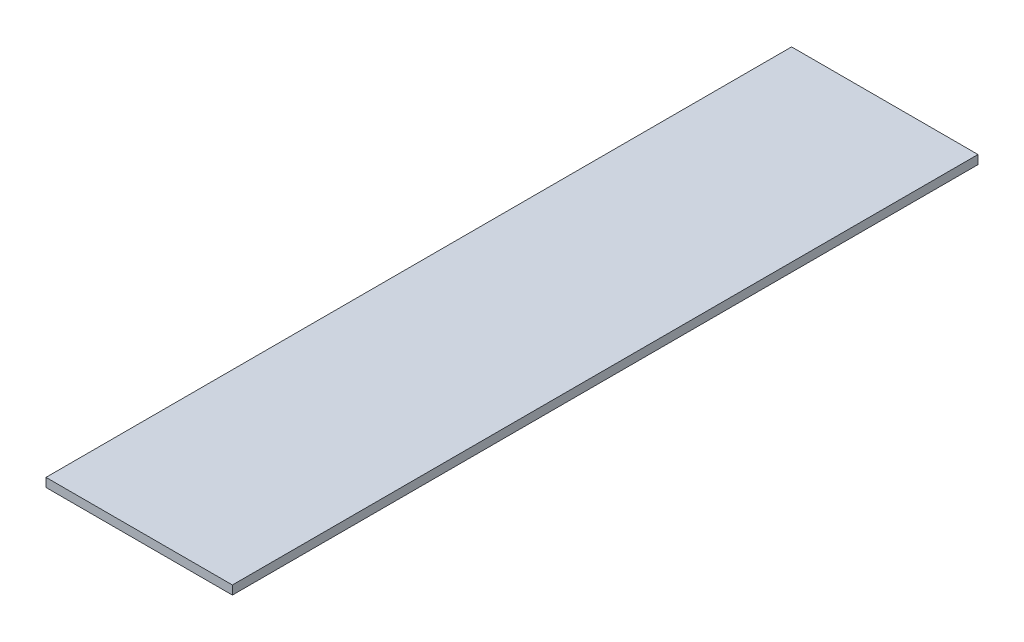
ISO-10303-21;
HEADER;
FILE_DESCRIPTION(('STEP AP214'),'2;1');
FILE_NAME('part.step','',(''),(''),'','','');
FILE_SCHEMA(('AUTOMOTIVE_DESIGN { 1 0 10303 214 1 1 1 1 }'));
ENDSEC;
DATA;
#1=APPLICATION_CONTEXT('core data for automotive mechanical design processes');
#2=APPLICATION_PROTOCOL_DEFINITION('international standard','automotive_design',2000,#1);
#3=PRODUCT_CONTEXT('',#1,'mechanical');
#4=PRODUCT('Part','Part','',(#3));
#5=PRODUCT_RELATED_PRODUCT_CATEGORY('part','',(#4));
#6=PRODUCT_DEFINITION_FORMATION('','',#4);
#7=PRODUCT_DEFINITION_CONTEXT('part definition',#1,'design');
#8=PRODUCT_DEFINITION('design','',#6,#7);
#9=PRODUCT_DEFINITION_SHAPE('','',#8);
#10=(LENGTH_UNIT() NAMED_UNIT(*) SI_UNIT(.MILLI.,.METRE.));
#11=(NAMED_UNIT(*) PLANE_ANGLE_UNIT() SI_UNIT($,.RADIAN.));
#12=(NAMED_UNIT(*) SI_UNIT($,.STERADIAN.) SOLID_ANGLE_UNIT());
#13=UNCERTAINTY_MEASURE_WITH_UNIT(LENGTH_MEASURE(1.E-05),#10,'distance_accuracy_value','');
#14=(GEOMETRIC_REPRESENTATION_CONTEXT(3) GLOBAL_UNCERTAINTY_ASSIGNED_CONTEXT((#13)) GLOBAL_UNIT_ASSIGNED_CONTEXT((#10,
#11,#12)) REPRESENTATION_CONTEXT('',''));
#15=CARTESIAN_POINT('',(0.,0.,0.));
#16=DIRECTION('',(0.,0.,1.));
#17=DIRECTION('',(1.,0.,0.));
#18=AXIS2_PLACEMENT_3D('',#15,#16,#17);
#19=CARTESIAN_POINT('',(12.5,1.18,50.));
#20=DIRECTION('',(-1.,0.,0.));
#21=DIRECTION('',(0.,0.,1.));
#22=AXIS2_PLACEMENT_3D('',#19,#20,#21);
#23=PLANE('',#22);
#24=DIRECTION('',(0.,0.,-1.));
#25=VECTOR('',#24,1.);
#26=CARTESIAN_POINT('',(12.5,0.,50.));
#27=LINE('',#26,#25);
#28=CARTESIAN_POINT('',(12.5,0.,50.));
#29=VERTEX_POINT('',#28);
#30=CARTESIAN_POINT('',(12.5,0.,-50.));
#31=VERTEX_POINT('',#30);
#32=EDGE_CURVE('E107',#29,#31,#27,.T.);
#33=ORIENTED_EDGE('',*,*,#32,.T.);
#34=DIRECTION('',(0.,-1.,0.));
#35=VECTOR('',#34,1.);
#36=CARTESIAN_POINT('',(12.5,1.18,-50.));
#37=LINE('',#36,#35);
#38=CARTESIAN_POINT('',(12.5,1.18,-50.));
#39=VERTEX_POINT('',#38);
#40=EDGE_CURVE('E11',#39,#31,#37,.T.);
#41=ORIENTED_EDGE('',*,*,#40,.F.);
#42=DIRECTION('',(0.,0.,-1.));
#43=VECTOR('',#42,1.);
#44=CARTESIAN_POINT('',(12.5,1.18,50.));
#45=LINE('',#44,#43);
#46=CARTESIAN_POINT('',(12.5,1.18,50.));
#47=VERTEX_POINT('',#46);
#48=EDGE_CURVE('E91',#47,#39,#45,.T.);
#49=ORIENTED_EDGE('',*,*,#48,.F.);
#50=DIRECTION('',(0.,-1.,0.));
#51=VECTOR('',#50,1.);
#52=CARTESIAN_POINT('',(12.5,1.18,50.));
#53=LINE('',#52,#51);
#54=EDGE_CURVE('E103',#47,#29,#53,.T.);
#55=ORIENTED_EDGE('',*,*,#54,.T.);
#56=EDGE_LOOP('',(#33,#41,#49,#55));
#57=FACE_BOUND('',#56,.T.);
#58=ADVANCED_FACE('F39',(#57),#23,.F.);
#59=CARTESIAN_POINT('',(-12.5,1.18,-50.));
#60=DIRECTION('',(0.,0.,1.));
#61=DIRECTION('',(1.,0.,0.));
#62=AXIS2_PLACEMENT_3D('',#59,#60,#61);
#63=PLANE('',#62);
#64=DIRECTION('',(-1.,0.,0.));
#65=VECTOR('',#64,1.);
#66=CARTESIAN_POINT('',(-12.5,0.,-50.));
#67=LINE('',#66,#65);
#68=CARTESIAN_POINT('',(-12.5,0.,-50.));
#69=VERTEX_POINT('',#68);
#70=EDGE_CURVE('E96',#31,#69,#67,.T.);
#71=ORIENTED_EDGE('',*,*,#70,.T.);
#72=DIRECTION('',(0.,-1.,0.));
#73=VECTOR('',#72,1.);
#74=CARTESIAN_POINT('',(-12.5,1.18,-50.));
#75=LINE('',#74,#73);
#76=CARTESIAN_POINT('',(-12.5,1.18,-50.));
#77=VERTEX_POINT('',#76);
#78=EDGE_CURVE('E48',#77,#69,#75,.T.);
#79=ORIENTED_EDGE('',*,*,#78,.F.);
#80=DIRECTION('',(-1.,0.,0.));
#81=VECTOR('',#80,1.);
#82=CARTESIAN_POINT('',(-12.5,1.18,-50.));
#83=LINE('',#82,#81);
#84=EDGE_CURVE('E86',#39,#77,#83,.T.);
#85=ORIENTED_EDGE('',*,*,#84,.F.);
#86=ORIENTED_EDGE('',*,*,#40,.T.);
#87=EDGE_LOOP('',(#71,#79,#85,#86));
#88=FACE_BOUND('',#87,.T.);
#89=ADVANCED_FACE('F95',(#88),#63,.F.);
#90=CARTESIAN_POINT('',(-12.5,1.18,50.));
#91=DIRECTION('',(1.,0.,0.));
#92=DIRECTION('',(0.,0.,-1.));
#93=AXIS2_PLACEMENT_3D('',#90,#91,#92);
#94=PLANE('',#93);
#95=DIRECTION('',(0.,0.,1.));
#96=VECTOR('',#95,1.);
#97=CARTESIAN_POINT('',(-12.5,0.,50.));
#98=LINE('',#97,#96);
#99=CARTESIAN_POINT('',(-12.5,0.,50.));
#100=VERTEX_POINT('',#99);
#101=EDGE_CURVE('E73',#69,#100,#98,.T.);
#102=ORIENTED_EDGE('',*,*,#101,.T.);
#103=DIRECTION('',(0.,-1.,0.));
#104=VECTOR('',#103,1.);
#105=CARTESIAN_POINT('',(-12.5,1.18,50.));
#106=LINE('',#105,#104);
#107=CARTESIAN_POINT('',(-12.5,1.18,50.));
#108=VERTEX_POINT('',#107);
#109=EDGE_CURVE('E98',#108,#100,#106,.T.);
#110=ORIENTED_EDGE('',*,*,#109,.F.);
#111=DIRECTION('',(0.,0.,1.));
#112=VECTOR('',#111,1.);
#113=CARTESIAN_POINT('',(-12.5,1.18,50.));
#114=LINE('',#113,#112);
#115=EDGE_CURVE('E89',#77,#108,#114,.T.);
#116=ORIENTED_EDGE('',*,*,#115,.F.);
#117=ORIENTED_EDGE('',*,*,#78,.T.);
#118=EDGE_LOOP('',(#102,#110,#116,#117));
#119=FACE_BOUND('',#118,.T.);
#120=ADVANCED_FACE('F99',(#119),#94,.F.);
#121=CARTESIAN_POINT('',(-12.5,1.18,50.));
#122=DIRECTION('',(0.,0.,-1.));
#123=DIRECTION('',(-1.,0.,0.));
#124=AXIS2_PLACEMENT_3D('',#121,#122,#123);
#125=PLANE('',#124);
#126=DIRECTION('',(1.,0.,0.));
#127=VECTOR('',#126,1.);
#128=CARTESIAN_POINT('',(-12.5,0.,50.));
#129=LINE('',#128,#127);
#130=EDGE_CURVE('E79',#100,#29,#129,.T.);
#131=ORIENTED_EDGE('',*,*,#130,.T.);
#132=ORIENTED_EDGE('',*,*,#54,.F.);
#133=DIRECTION('',(1.,0.,0.));
#134=VECTOR('',#133,1.);
#135=CARTESIAN_POINT('',(-12.5,1.18,50.));
#136=LINE('',#135,#134);
#137=EDGE_CURVE('E56',#108,#47,#136,.T.);
#138=ORIENTED_EDGE('',*,*,#137,.F.);
#139=ORIENTED_EDGE('',*,*,#109,.T.);
#140=EDGE_LOOP('',(#131,#132,#138,#139));
#141=FACE_BOUND('',#140,.T.);
#142=ADVANCED_FACE('F120',(#141),#125,.F.);
#143=CARTESIAN_POINT('',(0.,1.18,0.));
#144=DIRECTION('',(0.,-1.,0.));
#145=DIRECTION('',(0.,0.,-1.));
#146=AXIS2_PLACEMENT_3D('',#143,#144,#145);
#147=PLANE('',#146);
#148=ORIENTED_EDGE('',*,*,#48,.T.);
#149=ORIENTED_EDGE('',*,*,#84,.T.);
#150=ORIENTED_EDGE('',*,*,#115,.T.);
#151=ORIENTED_EDGE('',*,*,#137,.T.);
#152=EDGE_LOOP('',(#148,#149,#150,#151));
#153=FACE_BOUND('',#152,.T.);
#154=ADVANCED_FACE('F87',(#153),#147,.F.);
#155=CARTESIAN_POINT('',(0.,0.,0.));
#156=DIRECTION('',(0.,-1.,0.));
#157=DIRECTION('',(0.,0.,-1.));
#158=AXIS2_PLACEMENT_3D('',#155,#156,#157);
#159=PLANE('',#158);
#160=ORIENTED_EDGE('',*,*,#32,.F.);
#161=ORIENTED_EDGE('',*,*,#130,.F.);
#162=ORIENTED_EDGE('',*,*,#101,.F.);
#163=ORIENTED_EDGE('',*,*,#70,.F.);
#164=EDGE_LOOP('',(#160,#161,#162,#163));
#165=FACE_BOUND('',#164,.T.);
#166=ADVANCED_FACE('F123',(#165),#159,.T.);
#167=CLOSED_SHELL('',(#58,#89,#120,#142,#154,#166));
#168=MANIFOLD_SOLID_BREP('B2',#167);
#169=ADVANCED_BREP_SHAPE_REPRESENTATION('',(#18,#168),#14);
#170=SHAPE_DEFINITION_REPRESENTATION(#9,#169);
ENDSEC;
END-ISO-10303-21;
